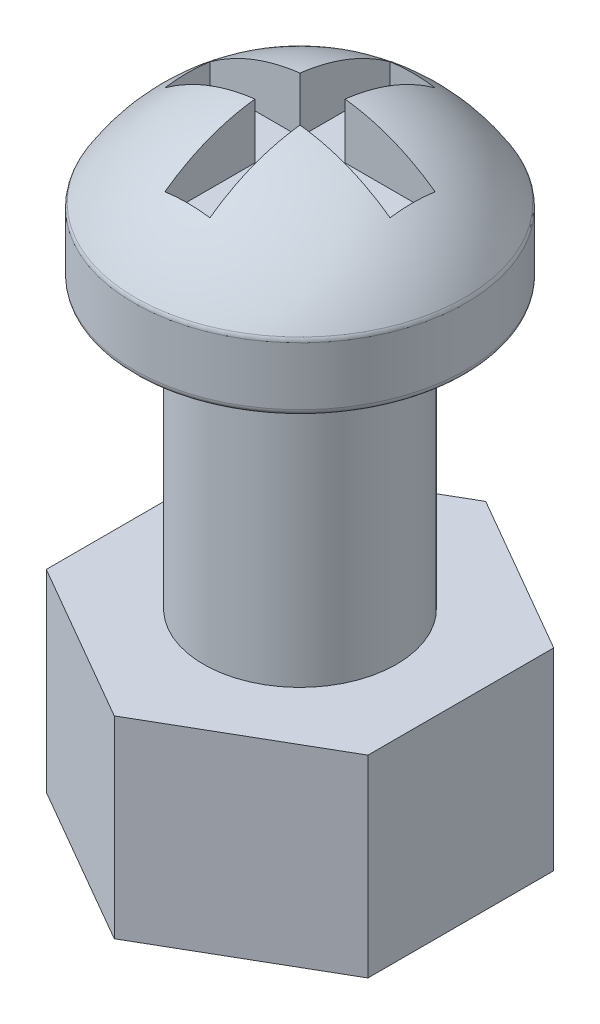
ISO-10303-21;
HEADER;
FILE_DESCRIPTION(('STEP AP214'),'2;1');
FILE_NAME('part.step','',(''),(''),'','','');
FILE_SCHEMA(('AUTOMOTIVE_DESIGN { 1 0 10303 214 1 1 1 1 }'));
ENDSEC;
DATA;
#1=APPLICATION_CONTEXT('core data for automotive mechanical design processes');
#2=APPLICATION_PROTOCOL_DEFINITION('international standard','automotive_design',2000,#1);
#3=PRODUCT_CONTEXT('',#1,'mechanical');
#4=PRODUCT('Part','Part','',(#3));
#5=PRODUCT_RELATED_PRODUCT_CATEGORY('part','',(#4));
#6=PRODUCT_DEFINITION_FORMATION('','',#4);
#7=PRODUCT_DEFINITION_CONTEXT('part definition',#1,'design');
#8=PRODUCT_DEFINITION('design','',#6,#7);
#9=PRODUCT_DEFINITION_SHAPE('','',#8);
#10=(LENGTH_UNIT() NAMED_UNIT(*) SI_UNIT(.MILLI.,.METRE.));
#11=(NAMED_UNIT(*) PLANE_ANGLE_UNIT() SI_UNIT($,.RADIAN.));
#12=(NAMED_UNIT(*) SI_UNIT($,.STERADIAN.) SOLID_ANGLE_UNIT());
#13=UNCERTAINTY_MEASURE_WITH_UNIT(LENGTH_MEASURE(1.E-05),#10,'distance_accuracy_value','');
#14=(GEOMETRIC_REPRESENTATION_CONTEXT(3) GLOBAL_UNCERTAINTY_ASSIGNED_CONTEXT((#13)) GLOBAL_UNIT_ASSIGNED_CONTEXT((#10,
#11,#12)) REPRESENTATION_CONTEXT('',''));
#15=CARTESIAN_POINT('',(0.,0.,0.));
#16=DIRECTION('',(0.,0.,1.));
#17=DIRECTION('',(1.,0.,0.));
#18=AXIS2_PLACEMENT_3D('',#15,#16,#17);
#19=CARTESIAN_POINT('',(1.25,30.,2.1650635094611));
#20=DIRECTION('',(-0.5,0.,-0.866025403784439));
#21=DIRECTION('',(-0.866025403784439,0.,0.5));
#22=AXIS2_PLACEMENT_3D('',#19,#20,#21);
#23=PLANE('',#22);
#24=DIRECTION('',(-0.866025403784439,0.,0.5));
#25=VECTOR('',#24,1.);
#26=CARTESIAN_POINT('',(1.25,27.,2.1650635094611));
#27=LINE('',#26,#25);
#28=CARTESIAN_POINT('',(2.5,27.,1.44337567297407));
#29=VERTEX_POINT('',#28);
#30=CARTESIAN_POINT('',(0.,27.,2.88675134594813));
#31=VERTEX_POINT('',#30);
#32=EDGE_CURVE('E56',#29,#31,#27,.T.);
#33=ORIENTED_EDGE('',*,*,#32,.F.);
#34=DIRECTION('',(0.,-1.,0.));
#35=VECTOR('',#34,1.);
#36=CARTESIAN_POINT('',(2.5,30.,1.44337567297407));
#37=LINE('',#36,#35);
#38=CARTESIAN_POINT('',(2.5,30.,1.44337567297407));
#39=VERTEX_POINT('',#38);
#40=EDGE_CURVE('E202',#39,#29,#37,.T.);
#41=ORIENTED_EDGE('',*,*,#40,.F.);
#42=DIRECTION('',(0.866025403784439,0.,-0.5));
#43=VECTOR('',#42,1.);
#44=CARTESIAN_POINT('',(1.25,30.,2.1650635094611));
#45=LINE('',#44,#43);
#46=CARTESIAN_POINT('',(0.,30.,2.88675134594813));
#47=VERTEX_POINT('',#46);
#48=EDGE_CURVE('E280',#47,#39,#45,.T.);
#49=ORIENTED_EDGE('',*,*,#48,.F.);
#50=DIRECTION('',(0.,-1.,0.));
#51=VECTOR('',#50,1.);
#52=CARTESIAN_POINT('',(0.,30.,2.88675134594813));
#53=LINE('',#52,#51);
#54=EDGE_CURVE('E186',#47,#31,#53,.T.);
#55=ORIENTED_EDGE('',*,*,#54,.T.);
#56=EDGE_LOOP('',(#33,#41,#49,#55));
#57=FACE_BOUND('',#56,.T.);
#58=ADVANCED_FACE('F41',(#57),#23,.F.);
#59=CARTESIAN_POINT('',(2.5,30.,0.));
#60=DIRECTION('',(-1.,0.,0.));
#61=DIRECTION('',(0.,0.,1.));
#62=AXIS2_PLACEMENT_3D('',#59,#60,#61);
#63=PLANE('',#62);
#64=DIRECTION('',(0.,0.,1.));
#65=VECTOR('',#64,1.);
#66=CARTESIAN_POINT('',(2.5,27.,0.));
#67=LINE('',#66,#65);
#68=CARTESIAN_POINT('',(2.5,27.,-1.44337567297407));
#69=VERTEX_POINT('',#68);
#70=EDGE_CURVE('E311',#69,#29,#67,.T.);
#71=ORIENTED_EDGE('',*,*,#70,.F.);
#72=DIRECTION('',(0.,-1.,0.));
#73=VECTOR('',#72,1.);
#74=CARTESIAN_POINT('',(2.5,30.,-1.44337567297407));
#75=LINE('',#74,#73);
#76=CARTESIAN_POINT('',(2.5,30.,-1.44337567297407));
#77=VERTEX_POINT('',#76);
#78=EDGE_CURVE('E198',#77,#69,#75,.T.);
#79=ORIENTED_EDGE('',*,*,#78,.F.);
#80=DIRECTION('',(0.,0.,-1.));
#81=VECTOR('',#80,1.);
#82=CARTESIAN_POINT('',(2.5,30.,0.));
#83=LINE('',#82,#81);
#84=EDGE_CURVE('E290',#39,#77,#83,.T.);
#85=ORIENTED_EDGE('',*,*,#84,.F.);
#86=ORIENTED_EDGE('',*,*,#40,.T.);
#87=EDGE_LOOP('',(#71,#79,#85,#86));
#88=FACE_BOUND('',#87,.T.);
#89=ADVANCED_FACE('F309',(#88),#63,.F.);
#90=CARTESIAN_POINT('',(1.25,30.,-2.1650635094611));
#91=DIRECTION('',(-0.5,0.,0.866025403784439));
#92=DIRECTION('',(0.866025403784439,0.,0.5));
#93=AXIS2_PLACEMENT_3D('',#90,#91,#92);
#94=PLANE('',#93);
#95=DIRECTION('',(0.866025403784439,0.,0.5));
#96=VECTOR('',#95,1.);
#97=CARTESIAN_POINT('',(1.25,27.,-2.1650635094611));
#98=LINE('',#97,#96);
#99=CARTESIAN_POINT('',(0.,27.,-2.88675134594813));
#100=VERTEX_POINT('',#99);
#101=EDGE_CURVE('E318',#100,#69,#98,.T.);
#102=ORIENTED_EDGE('',*,*,#101,.F.);
#103=DIRECTION('',(0.,-1.,0.));
#104=VECTOR('',#103,1.);
#105=CARTESIAN_POINT('',(0.,30.,-2.88675134594813));
#106=LINE('',#105,#104);
#107=CARTESIAN_POINT('',(0.,30.,-2.88675134594813));
#108=VERTEX_POINT('',#107);
#109=EDGE_CURVE('E190',#108,#100,#106,.T.);
#110=ORIENTED_EDGE('',*,*,#109,.F.);
#111=DIRECTION('',(-0.866025403784439,0.,-0.5));
#112=VECTOR('',#111,1.);
#113=CARTESIAN_POINT('',(1.25,30.,-2.1650635094611));
#114=LINE('',#113,#112);
#115=EDGE_CURVE('E293',#77,#108,#114,.T.);
#116=ORIENTED_EDGE('',*,*,#115,.F.);
#117=ORIENTED_EDGE('',*,*,#78,.T.);
#118=EDGE_LOOP('',(#102,#110,#116,#117));
#119=FACE_BOUND('',#118,.T.);
#120=ADVANCED_FACE('F317',(#119),#94,.F.);
#121=CARTESIAN_POINT('',(-1.25,30.,-2.1650635094611));
#122=DIRECTION('',(0.5,0.,0.866025403784439));
#123=DIRECTION('',(0.866025403784439,0.,-0.5));
#124=AXIS2_PLACEMENT_3D('',#121,#122,#123);
#125=PLANE('',#124);
#126=DIRECTION('',(0.866025403784439,0.,-0.5));
#127=VECTOR('',#126,1.);
#128=CARTESIAN_POINT('',(-1.25,27.,-2.1650635094611));
#129=LINE('',#128,#127);
#130=CARTESIAN_POINT('',(-2.5,27.,-1.44337567297406));
#131=VERTEX_POINT('',#130);
#132=EDGE_CURVE('E181',#131,#100,#129,.T.);
#133=ORIENTED_EDGE('',*,*,#132,.F.);
#134=DIRECTION('',(0.,-1.,0.));
#135=VECTOR('',#134,1.);
#136=CARTESIAN_POINT('',(-2.5,30.,-1.44337567297406));
#137=LINE('',#136,#135);
#138=CARTESIAN_POINT('',(-2.5,30.,-1.44337567297406));
#139=VERTEX_POINT('',#138);
#140=EDGE_CURVE('E179',#139,#131,#137,.T.);
#141=ORIENTED_EDGE('',*,*,#140,.F.);
#142=DIRECTION('',(-0.866025403784439,0.,0.5));
#143=VECTOR('',#142,1.);
#144=CARTESIAN_POINT('',(-1.25,30.,-2.1650635094611));
#145=LINE('',#144,#143);
#146=EDGE_CURVE('E296',#108,#139,#145,.T.);
#147=ORIENTED_EDGE('',*,*,#146,.F.);
#148=ORIENTED_EDGE('',*,*,#109,.T.);
#149=EDGE_LOOP('',(#133,#141,#147,#148));
#150=FACE_BOUND('',#149,.T.);
#151=ADVANCED_FACE('F320',(#150),#125,.F.);
#152=CARTESIAN_POINT('',(-2.5,30.,0.));
#153=DIRECTION('',(1.,0.,0.));
#154=DIRECTION('',(0.,0.,-1.));
#155=AXIS2_PLACEMENT_3D('',#152,#153,#154);
#156=PLANE('',#155);
#157=DIRECTION('',(0.,0.,-1.));
#158=VECTOR('',#157,1.);
#159=CARTESIAN_POINT('',(-2.5,27.,0.));
#160=LINE('',#159,#158);
#161=CARTESIAN_POINT('',(-2.5,27.,1.44337567297406));
#162=VERTEX_POINT('',#161);
#163=EDGE_CURVE('E165',#162,#131,#160,.T.);
#164=ORIENTED_EDGE('',*,*,#163,.F.);
#165=DIRECTION('',(0.,-1.,0.));
#166=VECTOR('',#165,1.);
#167=CARTESIAN_POINT('',(-2.5,30.,1.44337567297406));
#168=LINE('',#167,#166);
#169=CARTESIAN_POINT('',(-2.5,30.,1.44337567297406));
#170=VERTEX_POINT('',#169);
#171=EDGE_CURVE('E176',#170,#162,#168,.T.);
#172=ORIENTED_EDGE('',*,*,#171,.F.);
#173=DIRECTION('',(0.,0.,1.));
#174=VECTOR('',#173,1.);
#175=CARTESIAN_POINT('',(-2.5,30.,0.));
#176=LINE('',#175,#174);
#177=EDGE_CURVE('E299',#139,#170,#176,.T.);
#178=ORIENTED_EDGE('',*,*,#177,.F.);
#179=ORIENTED_EDGE('',*,*,#140,.T.);
#180=EDGE_LOOP('',(#164,#172,#178,#179));
#181=FACE_BOUND('',#180,.T.);
#182=ADVANCED_FACE('F174',(#181),#156,.F.);
#183=CARTESIAN_POINT('',(-1.25,30.,2.1650635094611));
#184=DIRECTION('',(0.5,0.,-0.866025403784439));
#185=DIRECTION('',(-0.866025403784439,0.,-0.5));
#186=AXIS2_PLACEMENT_3D('',#183,#184,#185);
#187=PLANE('',#186);
#188=DIRECTION('',(-0.866025403784439,0.,-0.5));
#189=VECTOR('',#188,1.);
#190=CARTESIAN_POINT('',(-1.25,27.,2.1650635094611));
#191=LINE('',#190,#189);
#192=EDGE_CURVE('E11',#31,#162,#191,.T.);
#193=ORIENTED_EDGE('',*,*,#192,.F.);
#194=ORIENTED_EDGE('',*,*,#54,.F.);
#195=DIRECTION('',(0.866025403784439,0.,0.5));
#196=VECTOR('',#195,1.);
#197=CARTESIAN_POINT('',(-1.25,30.,2.1650635094611));
#198=LINE('',#197,#196);
#199=EDGE_CURVE('E184',#170,#47,#198,.T.);
#200=ORIENTED_EDGE('',*,*,#199,.F.);
#201=ORIENTED_EDGE('',*,*,#171,.T.);
#202=EDGE_LOOP('',(#193,#194,#200,#201));
#203=FACE_BOUND('',#202,.T.);
#204=ADVANCED_FACE('F183',(#203),#187,.F.);
#205=CARTESIAN_POINT('',(0.,30.,0.));
#206=DIRECTION('',(0.,1.,0.));
#207=DIRECTION('',(0.,0.,1.));
#208=AXIS2_PLACEMENT_3D('',#205,#206,#207);
#209=PLANE('',#208);
#210=CARTESIAN_POINT('',(0.,30.,0.));
#211=DIRECTION('',(0.,1.,0.));
#212=DIRECTION('',(-1.,0.,0.));
#213=AXIS2_PLACEMENT_3D('',#210,#211,#212);
#214=CIRCLE('',#213,1.5);
#215=CARTESIAN_POINT('',(-1.5,30.,0.));
#216=VERTEX_POINT('',#215);
#217=EDGE_CURVE('E206',#216,#216,#214,.T.);
#218=ORIENTED_EDGE('',*,*,#217,.F.);
#219=EDGE_LOOP('',(#218));
#220=FACE_BOUND('',#219,.T.);
#221=ORIENTED_EDGE('',*,*,#48,.T.);
#222=ORIENTED_EDGE('',*,*,#84,.T.);
#223=ORIENTED_EDGE('',*,*,#115,.T.);
#224=ORIENTED_EDGE('',*,*,#146,.T.);
#225=ORIENTED_EDGE('',*,*,#177,.T.);
#226=ORIENTED_EDGE('',*,*,#199,.T.);
#227=EDGE_LOOP('',(#221,#222,#223,#224,#225,#226));
#228=FACE_BOUND('',#227,.T.);
#229=ADVANCED_FACE('F303',(#220,#228),#209,.T.);
#230=CARTESIAN_POINT('',(0.,30.,0.));
#231=DIRECTION('',(0.,1.,0.));
#232=DIRECTION('',(-1.,0.,0.));
#233=AXIS2_PLACEMENT_3D('',#230,#231,#232);
#234=CYLINDRICAL_SURFACE('',#233,1.5);
#235=CARTESIAN_POINT('',(0.,34.4,0.));
#236=DIRECTION('',(0.,1.,0.));
#237=DIRECTION('',(-1.,0.,0.));
#238=AXIS2_PLACEMENT_3D('',#235,#236,#237);
#239=CIRCLE('',#238,1.5);
#240=CARTESIAN_POINT('',(-1.5,34.4,0.));
#241=VERTEX_POINT('',#240);
#242=EDGE_CURVE('E274',#241,#241,#239,.T.);
#243=ORIENTED_EDGE('',*,*,#242,.F.);
#244=EDGE_LOOP('',(#243));
#245=FACE_BOUND('',#244,.T.);
#246=ORIENTED_EDGE('',*,*,#217,.T.);
#247=EDGE_LOOP('',(#246));
#248=FACE_BOUND('',#247,.T.);
#249=ADVANCED_FACE('F420',(#245,#248),#234,.T.);
#250=CARTESIAN_POINT('',(0.,34.4,0.));
#251=DIRECTION('',(0.,1.,0.));
#252=DIRECTION('',(-1.,0.,0.));
#253=AXIS2_PLACEMENT_3D('',#250,#251,#252);
#254=PLANE('',#253);
#255=CARTESIAN_POINT('',(0.,34.4,0.));
#256=DIRECTION('',(0.,1.,0.));
#257=DIRECTION('',(-1.,0.,0.));
#258=AXIS2_PLACEMENT_3D('',#255,#256,#257);
#259=CIRCLE('',#258,2.47767710879357);
#260=CARTESIAN_POINT('',(-2.47767710879357,34.4,0.));
#261=VERTEX_POINT('',#260);
#262=EDGE_CURVE('E50',#261,#261,#259,.F.);
#263=ORIENTED_EDGE('',*,*,#262,.T.);
#264=EDGE_LOOP('',(#263));
#265=FACE_BOUND('',#264,.T.);
#266=ORIENTED_EDGE('',*,*,#242,.T.);
#267=EDGE_LOOP('',(#266));
#268=FACE_BOUND('',#267,.T.);
#269=ADVANCED_FACE('F256',(#265,#268),#254,.F.);
#270=CARTESIAN_POINT('',(0.,30.,0.));
#271=DIRECTION('',(0.,1.,0.));
#272=DIRECTION('',(-1.,0.,0.));
#273=AXIS2_PLACEMENT_3D('',#270,#271,#272);
#274=CYLINDRICAL_SURFACE('',#273,2.57767710879357);
#275=CARTESIAN_POINT('',(0.,34.5,0.));
#276=DIRECTION('',(0.,1.,0.));
#277=DIRECTION('',(-1.,0.,0.));
#278=AXIS2_PLACEMENT_3D('',#275,#276,#277);
#279=CIRCLE('',#278,2.57767710879357);
#280=CARTESIAN_POINT('',(-2.57767710879357,34.5,0.));
#281=VERTEX_POINT('',#280);
#282=EDGE_CURVE('E249',#281,#281,#279,.T.);
#283=ORIENTED_EDGE('',*,*,#282,.T.);
#284=EDGE_LOOP('',(#283));
#285=FACE_BOUND('',#284,.T.);
#286=CARTESIAN_POINT('',(0.,35.4,0.));
#287=DIRECTION('',(0.,1.,0.));
#288=DIRECTION('',(-1.,0.,0.));
#289=AXIS2_PLACEMENT_3D('',#286,#287,#288);
#290=CIRCLE('',#289,2.57767710879357);
#291=CARTESIAN_POINT('',(-2.57767710879357,35.4,0.));
#292=VERTEX_POINT('',#291);
#293=EDGE_CURVE('E271',#292,#292,#290,.T.);
#294=ORIENTED_EDGE('',*,*,#293,.F.);
#295=EDGE_LOOP('',(#294));
#296=FACE_BOUND('',#295,.T.);
#297=ADVANCED_FACE('F264',(#285,#296),#274,.T.);
#298=CARTESIAN_POINT('',(0.,35.4,0.));
#299=DIRECTION('',(0.,1.,0.));
#300=DIRECTION('',(-1.,0.,0.));
#301=AXIS2_PLACEMENT_3D('',#298,#299,#300);
#302=TOROIDAL_SURFACE('',#301,2.45267710879357,0.125);
#303=CARTESIAN_POINT('',(0.,35.4652173913043,0.));
#304=DIRECTION('',(0.,1.,0.));
#305=DIRECTION('',(-1.,0.,0.));
#306=AXIS2_PLACEMENT_3D('',#303,#304,#305);
#307=CIRCLE('',#306,2.55931524395851);
#308=CARTESIAN_POINT('',(-2.55931524395851,35.4652173913043,0.));
#309=VERTEX_POINT('',#308);
#310=EDGE_CURVE('E275',#309,#309,#307,.T.);
#311=ORIENTED_EDGE('',*,*,#310,.F.);
#312=EDGE_LOOP('',(#311));
#313=FACE_BOUND('',#312,.T.);
#314=ORIENTED_EDGE('',*,*,#293,.T.);
#315=EDGE_LOOP('',(#314));
#316=FACE_BOUND('',#315,.T.);
#317=ADVANCED_FACE('F267',(#313,#316),#302,.T.);
#318=CARTESIAN_POINT('',(0.,33.9,0.));
#319=DIRECTION('',(0.,1.,0.));
#320=DIRECTION('',(1.,0.,0.));
#321=AXIS2_PLACEMENT_3D('',#318,#319,#320);
#322=SPHERICAL_SURFACE('',#321,3.);
#323=CARTESIAN_POINT('',(0.35,33.9,0.));
#324=DIRECTION('',(1.,0.,0.));
#325=DIRECTION('',(0.,0.,-1.));
#326=AXIS2_PLACEMENT_3D('',#323,#324,#325);
#327=CIRCLE('',#326,2.97951338308792);
#328=CARTESIAN_POINT('',(0.35,36.8588849251027,0.35));
#329=VERTEX_POINT('',#328);
#330=CARTESIAN_POINT('',(0.35,36.3114311103575,1.75));
#331=VERTEX_POINT('',#330);
#332=EDGE_CURVE('E207',#329,#331,#327,.T.);
#333=ORIENTED_EDGE('',*,*,#332,.T.);
#334=CARTESIAN_POINT('',(0.,33.9,1.75));
#335=DIRECTION('',(0.,0.,1.));
#336=DIRECTION('',(1.,0.,0.));
#337=AXIS2_PLACEMENT_3D('',#334,#335,#336);
#338=CIRCLE('',#337,2.43669858620224);
#339=CARTESIAN_POINT('',(-0.35,36.3114311103575,1.75));
#340=VERTEX_POINT('',#339);
#341=EDGE_CURVE('E245',#331,#340,#338,.T.);
#342=ORIENTED_EDGE('',*,*,#341,.T.);
#343=CARTESIAN_POINT('',(-0.35,33.9,0.));
#344=DIRECTION('',(1.,0.,0.));
#345=DIRECTION('',(0.,0.,-1.));
#346=AXIS2_PLACEMENT_3D('',#343,#344,#345);
#347=CIRCLE('',#346,2.97951338308792);
#348=CARTESIAN_POINT('',(-0.35,36.8588849251027,0.35));
#349=VERTEX_POINT('',#348);
#350=EDGE_CURVE('E242',#349,#340,#347,.T.);
#351=ORIENTED_EDGE('',*,*,#350,.F.);
#352=CARTESIAN_POINT('',(0.,33.9,0.35));
#353=DIRECTION('',(0.,0.,1.));
#354=DIRECTION('',(1.,0.,0.));
#355=AXIS2_PLACEMENT_3D('',#352,#353,#354);
#356=CIRCLE('',#355,2.97951338308792);
#357=CARTESIAN_POINT('',(-1.75,36.3114311103575,0.35));
#358=VERTEX_POINT('',#357);
#359=EDGE_CURVE('E238',#349,#358,#356,.T.);
#360=ORIENTED_EDGE('',*,*,#359,.T.);
#361=CARTESIAN_POINT('',(-1.75,33.9,0.));
#362=DIRECTION('',(1.,0.,0.));
#363=DIRECTION('',(0.,0.,-1.));
#364=AXIS2_PLACEMENT_3D('',#361,#362,#363);
#365=CIRCLE('',#364,2.43669858620224);
#366=CARTESIAN_POINT('',(-1.75,36.3114311103575,-0.35));
#367=VERTEX_POINT('',#366);
#368=EDGE_CURVE('E235',#367,#358,#365,.T.);
#369=ORIENTED_EDGE('',*,*,#368,.F.);
#370=CARTESIAN_POINT('',(0.,33.9,-0.35));
#371=DIRECTION('',(0.,0.,1.));
#372=DIRECTION('',(1.,0.,0.));
#373=AXIS2_PLACEMENT_3D('',#370,#371,#372);
#374=CIRCLE('',#373,2.97951338308792);
#375=CARTESIAN_POINT('',(-0.35,36.8588849251027,-0.35));
#376=VERTEX_POINT('',#375);
#377=EDGE_CURVE('E232',#376,#367,#374,.T.);
#378=ORIENTED_EDGE('',*,*,#377,.F.);
#379=CARTESIAN_POINT('',(-0.35,33.9,0.));
#380=DIRECTION('',(1.,0.,0.));
#381=DIRECTION('',(0.,0.,-1.));
#382=AXIS2_PLACEMENT_3D('',#379,#380,#381);
#383=CIRCLE('',#382,2.97951338308792);
#384=CARTESIAN_POINT('',(-0.35,36.3114311103575,-1.75));
#385=VERTEX_POINT('',#384);
#386=EDGE_CURVE('E229',#385,#376,#383,.T.);
#387=ORIENTED_EDGE('',*,*,#386,.F.);
#388=CARTESIAN_POINT('',(0.,33.9,-1.75));
#389=DIRECTION('',(0.,0.,1.));
#390=DIRECTION('',(1.,0.,0.));
#391=AXIS2_PLACEMENT_3D('',#388,#389,#390);
#392=CIRCLE('',#391,2.43669858620224);
#393=CARTESIAN_POINT('',(0.35,36.3114311103575,-1.75));
#394=VERTEX_POINT('',#393);
#395=EDGE_CURVE('E226',#394,#385,#392,.T.);
#396=ORIENTED_EDGE('',*,*,#395,.F.);
#397=CARTESIAN_POINT('',(0.35,33.9,0.));
#398=DIRECTION('',(1.,0.,0.));
#399=DIRECTION('',(0.,0.,-1.));
#400=AXIS2_PLACEMENT_3D('',#397,#398,#399);
#401=CIRCLE('',#400,2.97951338308792);
#402=CARTESIAN_POINT('',(0.35,36.8588849251027,-0.35));
#403=VERTEX_POINT('',#402);
#404=EDGE_CURVE('E222',#394,#403,#401,.T.);
#405=ORIENTED_EDGE('',*,*,#404,.T.);
#406=CARTESIAN_POINT('',(0.,33.9,-0.35));
#407=DIRECTION('',(0.,0.,1.));
#408=DIRECTION('',(1.,0.,0.));
#409=AXIS2_PLACEMENT_3D('',#406,#407,#408);
#410=CIRCLE('',#409,2.97951338308792);
#411=CARTESIAN_POINT('',(1.75,36.3114311103575,-0.35));
#412=VERTEX_POINT('',#411);
#413=EDGE_CURVE('E219',#412,#403,#410,.T.);
#414=ORIENTED_EDGE('',*,*,#413,.F.);
#415=CARTESIAN_POINT('',(1.75,33.9,0.));
#416=DIRECTION('',(1.,0.,0.));
#417=DIRECTION('',(0.,0.,-1.));
#418=AXIS2_PLACEMENT_3D('',#415,#416,#417);
#419=CIRCLE('',#418,2.43669858620224);
#420=CARTESIAN_POINT('',(1.75,36.3114311103575,0.35));
#421=VERTEX_POINT('',#420);
#422=EDGE_CURVE('E215',#412,#421,#419,.T.);
#423=ORIENTED_EDGE('',*,*,#422,.T.);
#424=CARTESIAN_POINT('',(0.,33.9,0.35));
#425=DIRECTION('',(0.,0.,1.));
#426=DIRECTION('',(1.,0.,0.));
#427=AXIS2_PLACEMENT_3D('',#424,#425,#426);
#428=CIRCLE('',#427,2.97951338308792);
#429=EDGE_CURVE('E211',#421,#329,#428,.T.);
#430=ORIENTED_EDGE('',*,*,#429,.T.);
#431=EDGE_LOOP('',(#333,#342,#351,#360,#369,#378,#387,#396,#405,#414,#423,#430));
#432=FACE_BOUND('',#431,.T.);
#433=ORIENTED_EDGE('',*,*,#310,.T.);
#434=EDGE_LOOP('',(#433));
#435=FACE_BOUND('',#434,.T.);
#436=ADVANCED_FACE('F568',(#432,#435),#322,.T.);
#437=CARTESIAN_POINT('',(0.,36.,1.75));
#438=DIRECTION('',(0.,0.,1.));
#439=DIRECTION('',(1.,0.,0.));
#440=AXIS2_PLACEMENT_3D('',#437,#438,#439);
#441=PLANE('',#440);
#442=DIRECTION('',(0.,1.,0.));
#443=VECTOR('',#442,1.);
#444=CARTESIAN_POINT('',(0.35,36.,1.75));
#445=LINE('',#444,#443);
#446=CARTESIAN_POINT('',(0.35,36.,1.75));
#447=VERTEX_POINT('',#446);
#448=EDGE_CURVE('E64',#447,#331,#445,.T.);
#449=ORIENTED_EDGE('',*,*,#448,.F.);
#450=DIRECTION('',(1.,0.,0.));
#451=VECTOR('',#450,1.);
#452=CARTESIAN_POINT('',(0.,36.,1.75));
#453=LINE('',#452,#451);
#454=CARTESIAN_POINT('',(-0.35,36.,1.75));
#455=VERTEX_POINT('',#454);
#456=EDGE_CURVE('E330',#455,#447,#453,.T.);
#457=ORIENTED_EDGE('',*,*,#456,.F.);
#458=DIRECTION('',(0.,1.,0.));
#459=VECTOR('',#458,1.);
#460=CARTESIAN_POINT('',(-0.35,36.,1.75));
#461=LINE('',#460,#459);
#462=EDGE_CURVE('E283',#455,#340,#461,.T.);
#463=ORIENTED_EDGE('',*,*,#462,.T.);
#464=ORIENTED_EDGE('',*,*,#341,.F.);
#465=EDGE_LOOP('',(#449,#457,#463,#464));
#466=FACE_BOUND('',#465,.T.);
#467=ADVANCED_FACE('F560',(#466),#441,.F.);
#468=CARTESIAN_POINT('',(-0.35,36.,0.));
#469=DIRECTION('',(1.,0.,0.));
#470=DIRECTION('',(0.,0.,-1.));
#471=AXIS2_PLACEMENT_3D('',#468,#469,#470);
#472=PLANE('',#471);
#473=ORIENTED_EDGE('',*,*,#350,.T.);
#474=ORIENTED_EDGE('',*,*,#462,.F.);
#475=DIRECTION('',(0.,0.,-1.));
#476=VECTOR('',#475,1.);
#477=CARTESIAN_POINT('',(-0.35,36.,0.));
#478=LINE('',#477,#476);
#479=CARTESIAN_POINT('',(-0.35,36.,0.35));
#480=VERTEX_POINT('',#479);
#481=EDGE_CURVE('E369',#455,#480,#478,.T.);
#482=ORIENTED_EDGE('',*,*,#481,.T.);
#483=DIRECTION('',(0.,1.,0.));
#484=VECTOR('',#483,1.);
#485=CARTESIAN_POINT('',(-0.35,36.,0.35));
#486=LINE('',#485,#484);
#487=EDGE_CURVE('E375',#480,#349,#486,.T.);
#488=ORIENTED_EDGE('',*,*,#487,.T.);
#489=EDGE_LOOP('',(#473,#474,#482,#488));
#490=FACE_BOUND('',#489,.T.);
#491=ADVANCED_FACE('F552',(#490),#472,.T.);
#492=CARTESIAN_POINT('',(0.,36.,0.35));
#493=DIRECTION('',(0.,0.,1.));
#494=DIRECTION('',(1.,0.,0.));
#495=AXIS2_PLACEMENT_3D('',#492,#493,#494);
#496=PLANE('',#495);
#497=ORIENTED_EDGE('',*,*,#487,.F.);
#498=DIRECTION('',(1.,0.,0.));
#499=VECTOR('',#498,1.);
#500=CARTESIAN_POINT('',(0.,36.,0.35));
#501=LINE('',#500,#499);
#502=CARTESIAN_POINT('',(-1.75,36.,0.35));
#503=VERTEX_POINT('',#502);
#504=EDGE_CURVE('E365',#503,#480,#501,.T.);
#505=ORIENTED_EDGE('',*,*,#504,.F.);
#506=DIRECTION('',(0.,1.,0.));
#507=VECTOR('',#506,1.);
#508=CARTESIAN_POINT('',(-1.75,36.,0.35));
#509=LINE('',#508,#507);
#510=EDGE_CURVE('E379',#503,#358,#509,.T.);
#511=ORIENTED_EDGE('',*,*,#510,.T.);
#512=ORIENTED_EDGE('',*,*,#359,.F.);
#513=EDGE_LOOP('',(#497,#505,#511,#512));
#514=FACE_BOUND('',#513,.T.);
#515=ADVANCED_FACE('F544',(#514),#496,.F.);
#516=CARTESIAN_POINT('',(-1.75,36.,0.));
#517=DIRECTION('',(1.,0.,0.));
#518=DIRECTION('',(0.,0.,-1.));
#519=AXIS2_PLACEMENT_3D('',#516,#517,#518);
#520=PLANE('',#519);
#521=ORIENTED_EDGE('',*,*,#368,.T.);
#522=ORIENTED_EDGE('',*,*,#510,.F.);
#523=DIRECTION('',(0.,0.,-1.));
#524=VECTOR('',#523,1.);
#525=CARTESIAN_POINT('',(-1.75,36.,0.));
#526=LINE('',#525,#524);
#527=CARTESIAN_POINT('',(-1.75,36.,-0.35));
#528=VERTEX_POINT('',#527);
#529=EDGE_CURVE('E362',#503,#528,#526,.T.);
#530=ORIENTED_EDGE('',*,*,#529,.T.);
#531=DIRECTION('',(0.,1.,0.));
#532=VECTOR('',#531,1.);
#533=CARTESIAN_POINT('',(-1.75,36.,-0.35));
#534=LINE('',#533,#532);
#535=EDGE_CURVE('E383',#528,#367,#534,.T.);
#536=ORIENTED_EDGE('',*,*,#535,.T.);
#537=EDGE_LOOP('',(#521,#522,#530,#536));
#538=FACE_BOUND('',#537,.T.);
#539=ADVANCED_FACE('F536',(#538),#520,.T.);
#540=CARTESIAN_POINT('',(0.,36.,-0.35));
#541=DIRECTION('',(0.,0.,1.));
#542=DIRECTION('',(1.,0.,0.));
#543=AXIS2_PLACEMENT_3D('',#540,#541,#542);
#544=PLANE('',#543);
#545=ORIENTED_EDGE('',*,*,#377,.T.);
#546=ORIENTED_EDGE('',*,*,#535,.F.);
#547=DIRECTION('',(1.,0.,0.));
#548=VECTOR('',#547,1.);
#549=CARTESIAN_POINT('',(0.,36.,-0.35));
#550=LINE('',#549,#548);
#551=CARTESIAN_POINT('',(-0.35,36.,-0.35));
#552=VERTEX_POINT('',#551);
#553=EDGE_CURVE('E359',#528,#552,#550,.T.);
#554=ORIENTED_EDGE('',*,*,#553,.T.);
#555=DIRECTION('',(0.,1.,0.));
#556=VECTOR('',#555,1.);
#557=CARTESIAN_POINT('',(-0.35,36.,-0.35));
#558=LINE('',#557,#556);
#559=EDGE_CURVE('E387',#552,#376,#558,.T.);
#560=ORIENTED_EDGE('',*,*,#559,.T.);
#561=EDGE_LOOP('',(#545,#546,#554,#560));
#562=FACE_BOUND('',#561,.T.);
#563=ADVANCED_FACE('F528',(#562),#544,.T.);
#564=CARTESIAN_POINT('',(-0.35,36.,0.));
#565=DIRECTION('',(1.,0.,0.));
#566=DIRECTION('',(0.,0.,-1.));
#567=AXIS2_PLACEMENT_3D('',#564,#565,#566);
#568=PLANE('',#567);
#569=ORIENTED_EDGE('',*,*,#386,.T.);
#570=ORIENTED_EDGE('',*,*,#559,.F.);
#571=DIRECTION('',(0.,0.,-1.));
#572=VECTOR('',#571,1.);
#573=CARTESIAN_POINT('',(-0.35,36.,0.));
#574=LINE('',#573,#572);
#575=CARTESIAN_POINT('',(-0.35,36.,-1.75));
#576=VERTEX_POINT('',#575);
#577=EDGE_CURVE('E356',#552,#576,#574,.T.);
#578=ORIENTED_EDGE('',*,*,#577,.T.);
#579=DIRECTION('',(0.,1.,0.));
#580=VECTOR('',#579,1.);
#581=CARTESIAN_POINT('',(-0.35,36.,-1.75));
#582=LINE('',#581,#580);
#583=EDGE_CURVE('E391',#576,#385,#582,.T.);
#584=ORIENTED_EDGE('',*,*,#583,.T.);
#585=EDGE_LOOP('',(#569,#570,#578,#584));
#586=FACE_BOUND('',#585,.T.);
#587=ADVANCED_FACE('F520',(#586),#568,.T.);
#588=CARTESIAN_POINT('',(0.,36.,-1.75));
#589=DIRECTION('',(0.,0.,1.));
#590=DIRECTION('',(1.,0.,0.));
#591=AXIS2_PLACEMENT_3D('',#588,#589,#590);
#592=PLANE('',#591);
#593=ORIENTED_EDGE('',*,*,#395,.T.);
#594=ORIENTED_EDGE('',*,*,#583,.F.);
#595=DIRECTION('',(1.,0.,0.));
#596=VECTOR('',#595,1.);
#597=CARTESIAN_POINT('',(0.,36.,-1.75));
#598=LINE('',#597,#596);
#599=CARTESIAN_POINT('',(0.35,36.,-1.75));
#600=VERTEX_POINT('',#599);
#601=EDGE_CURVE('E353',#576,#600,#598,.T.);
#602=ORIENTED_EDGE('',*,*,#601,.T.);
#603=DIRECTION('',(0.,1.,0.));
#604=VECTOR('',#603,1.);
#605=CARTESIAN_POINT('',(0.35,36.,-1.75));
#606=LINE('',#605,#604);
#607=EDGE_CURVE('E395',#600,#394,#606,.T.);
#608=ORIENTED_EDGE('',*,*,#607,.T.);
#609=EDGE_LOOP('',(#593,#594,#602,#608));
#610=FACE_BOUND('',#609,.T.);
#611=ADVANCED_FACE('F512',(#610),#592,.T.);
#612=CARTESIAN_POINT('',(0.35,36.,0.));
#613=DIRECTION('',(1.,0.,0.));
#614=DIRECTION('',(0.,0.,-1.));
#615=AXIS2_PLACEMENT_3D('',#612,#613,#614);
#616=PLANE('',#615);
#617=ORIENTED_EDGE('',*,*,#607,.F.);
#618=DIRECTION('',(0.,0.,-1.));
#619=VECTOR('',#618,1.);
#620=CARTESIAN_POINT('',(0.35,36.,0.));
#621=LINE('',#620,#619);
#622=CARTESIAN_POINT('',(0.35,36.,-0.35));
#623=VERTEX_POINT('',#622);
#624=EDGE_CURVE('E349',#623,#600,#621,.T.);
#625=ORIENTED_EDGE('',*,*,#624,.F.);
#626=DIRECTION('',(0.,1.,0.));
#627=VECTOR('',#626,1.);
#628=CARTESIAN_POINT('',(0.35,36.,-0.35));
#629=LINE('',#628,#627);
#630=EDGE_CURVE('E399',#623,#403,#629,.T.);
#631=ORIENTED_EDGE('',*,*,#630,.T.);
#632=ORIENTED_EDGE('',*,*,#404,.F.);
#633=EDGE_LOOP('',(#617,#625,#631,#632));
#634=FACE_BOUND('',#633,.T.);
#635=ADVANCED_FACE('F504',(#634),#616,.F.);
#636=CARTESIAN_POINT('',(0.,36.,-0.35));
#637=DIRECTION('',(0.,0.,1.));
#638=DIRECTION('',(1.,0.,0.));
#639=AXIS2_PLACEMENT_3D('',#636,#637,#638);
#640=PLANE('',#639);
#641=ORIENTED_EDGE('',*,*,#413,.T.);
#642=ORIENTED_EDGE('',*,*,#630,.F.);
#643=DIRECTION('',(1.,0.,0.));
#644=VECTOR('',#643,1.);
#645=CARTESIAN_POINT('',(0.,36.,-0.35));
#646=LINE('',#645,#644);
#647=CARTESIAN_POINT('',(1.75,36.,-0.35));
#648=VERTEX_POINT('',#647);
#649=EDGE_CURVE('E346',#623,#648,#646,.T.);
#650=ORIENTED_EDGE('',*,*,#649,.T.);
#651=DIRECTION('',(0.,1.,0.));
#652=VECTOR('',#651,1.);
#653=CARTESIAN_POINT('',(1.75,36.,-0.35));
#654=LINE('',#653,#652);
#655=EDGE_CURVE('E403',#648,#412,#654,.T.);
#656=ORIENTED_EDGE('',*,*,#655,.T.);
#657=EDGE_LOOP('',(#641,#642,#650,#656));
#658=FACE_BOUND('',#657,.T.);
#659=ADVANCED_FACE('F496',(#658),#640,.T.);
#660=CARTESIAN_POINT('',(1.75,36.,0.));
#661=DIRECTION('',(1.,0.,0.));
#662=DIRECTION('',(0.,0.,-1.));
#663=AXIS2_PLACEMENT_3D('',#660,#661,#662);
#664=PLANE('',#663);
#665=ORIENTED_EDGE('',*,*,#655,.F.);
#666=DIRECTION('',(0.,0.,-1.));
#667=VECTOR('',#666,1.);
#668=CARTESIAN_POINT('',(1.75,36.,0.));
#669=LINE('',#668,#667);
#670=CARTESIAN_POINT('',(1.75,36.,0.35));
#671=VERTEX_POINT('',#670);
#672=EDGE_CURVE('E342',#671,#648,#669,.T.);
#673=ORIENTED_EDGE('',*,*,#672,.F.);
#674=DIRECTION('',(0.,1.,0.));
#675=VECTOR('',#674,1.);
#676=CARTESIAN_POINT('',(1.75,36.,0.35));
#677=LINE('',#676,#675);
#678=EDGE_CURVE('E407',#671,#421,#677,.T.);
#679=ORIENTED_EDGE('',*,*,#678,.T.);
#680=ORIENTED_EDGE('',*,*,#422,.F.);
#681=EDGE_LOOP('',(#665,#673,#679,#680));
#682=FACE_BOUND('',#681,.T.);
#683=ADVANCED_FACE('F488',(#682),#664,.F.);
#684=CARTESIAN_POINT('',(0.,36.,0.35));
#685=DIRECTION('',(0.,0.,1.));
#686=DIRECTION('',(1.,0.,0.));
#687=AXIS2_PLACEMENT_3D('',#684,#685,#686);
#688=PLANE('',#687);
#689=ORIENTED_EDGE('',*,*,#678,.F.);
#690=DIRECTION('',(1.,0.,0.));
#691=VECTOR('',#690,1.);
#692=CARTESIAN_POINT('',(0.,36.,0.35));
#693=LINE('',#692,#691);
#694=CARTESIAN_POINT('',(0.35,36.,0.35));
#695=VERTEX_POINT('',#694);
#696=EDGE_CURVE('E338',#695,#671,#693,.T.);
#697=ORIENTED_EDGE('',*,*,#696,.F.);
#698=DIRECTION('',(0.,1.,0.));
#699=VECTOR('',#698,1.);
#700=CARTESIAN_POINT('',(0.35,36.,0.35));
#701=LINE('',#700,#699);
#702=EDGE_CURVE('E411',#695,#329,#701,.T.);
#703=ORIENTED_EDGE('',*,*,#702,.T.);
#704=ORIENTED_EDGE('',*,*,#429,.F.);
#705=EDGE_LOOP('',(#689,#697,#703,#704));
#706=FACE_BOUND('',#705,.T.);
#707=ADVANCED_FACE('F481',(#706),#688,.F.);
#708=CARTESIAN_POINT('',(0.35,36.,0.));
#709=DIRECTION('',(1.,0.,0.));
#710=DIRECTION('',(0.,0.,-1.));
#711=AXIS2_PLACEMENT_3D('',#708,#709,#710);
#712=PLANE('',#711);
#713=ORIENTED_EDGE('',*,*,#702,.F.);
#714=DIRECTION('',(0.,0.,-1.));
#715=VECTOR('',#714,1.);
#716=CARTESIAN_POINT('',(0.35,36.,0.));
#717=LINE('',#716,#715);
#718=EDGE_CURVE('E334',#447,#695,#717,.T.);
#719=ORIENTED_EDGE('',*,*,#718,.F.);
#720=ORIENTED_EDGE('',*,*,#448,.T.);
#721=ORIENTED_EDGE('',*,*,#332,.F.);
#722=EDGE_LOOP('',(#713,#719,#720,#721));
#723=FACE_BOUND('',#722,.T.);
#724=ADVANCED_FACE('F472',(#723),#712,.F.);
#725=CARTESIAN_POINT('',(0.,36.,0.));
#726=DIRECTION('',(0.,1.,0.));
#727=DIRECTION('',(0.,0.,1.));
#728=AXIS2_PLACEMENT_3D('',#725,#726,#727);
#729=PLANE('',#728);
#730=ORIENTED_EDGE('',*,*,#456,.T.);
#731=ORIENTED_EDGE('',*,*,#718,.T.);
#732=ORIENTED_EDGE('',*,*,#696,.T.);
#733=ORIENTED_EDGE('',*,*,#672,.T.);
#734=ORIENTED_EDGE('',*,*,#649,.F.);
#735=ORIENTED_EDGE('',*,*,#624,.T.);
#736=ORIENTED_EDGE('',*,*,#601,.F.);
#737=ORIENTED_EDGE('',*,*,#577,.F.);
#738=ORIENTED_EDGE('',*,*,#553,.F.);
#739=ORIENTED_EDGE('',*,*,#529,.F.);
#740=ORIENTED_EDGE('',*,*,#504,.T.);
#741=ORIENTED_EDGE('',*,*,#481,.F.);
#742=EDGE_LOOP('',(#730,#731,#732,#733,#734,#735,#736,#737,#738,#739,#740,#741));
#743=FACE_BOUND('',#742,.T.);
#744=ADVANCED_FACE('F261',(#743),#729,.T.);
#745=CARTESIAN_POINT('',(0.,34.5,0.));
#746=DIRECTION('',(0.,1.,0.));
#747=DIRECTION('',(-1.,0.,0.));
#748=AXIS2_PLACEMENT_3D('',#745,#746,#747);
#749=TOROIDAL_SURFACE('',#748,2.47767710879357,0.1);
#750=ORIENTED_EDGE('',*,*,#262,.F.);
#751=EDGE_LOOP('',(#750));
#752=FACE_BOUND('',#751,.T.);
#753=ORIENTED_EDGE('',*,*,#282,.F.);
#754=EDGE_LOOP('',(#753));
#755=FACE_BOUND('',#754,.T.);
#756=ADVANCED_FACE('F43',(#752,#755),#749,.T.);
#757=CARTESIAN_POINT('',(0.,27.,0.));
#758=DIRECTION('',(0.,-1.,0.));
#759=DIRECTION('',(0.,0.,-1.));
#760=AXIS2_PLACEMENT_3D('',#757,#758,#759);
#761=PLANE('',#760);
#762=ORIENTED_EDGE('',*,*,#32,.T.);
#763=ORIENTED_EDGE('',*,*,#192,.T.);
#764=ORIENTED_EDGE('',*,*,#163,.T.);
#765=ORIENTED_EDGE('',*,*,#132,.T.);
#766=ORIENTED_EDGE('',*,*,#101,.T.);
#767=ORIENTED_EDGE('',*,*,#70,.T.);
#768=EDGE_LOOP('',(#762,#763,#764,#765,#766,#767));
#769=FACE_BOUND('',#768,.T.);
#770=ADVANCED_FACE('F164',(#769),#761,.T.);
#771=CLOSED_SHELL('',(#58,#89,#120,#151,#182,#204,#229,#249,#269,#297,#317,#436,#467,#491,#515,
#539,#563,#587,#611,#635,#659,#683,#707,#724,#744,#756,#770));
#772=MANIFOLD_SOLID_BREP('B2',#771);
#773=ADVANCED_BREP_SHAPE_REPRESENTATION('',(#18,#772),#14);
#774=SHAPE_DEFINITION_REPRESENTATION(#9,#773);
ENDSEC;
END-ISO-10303-21;
